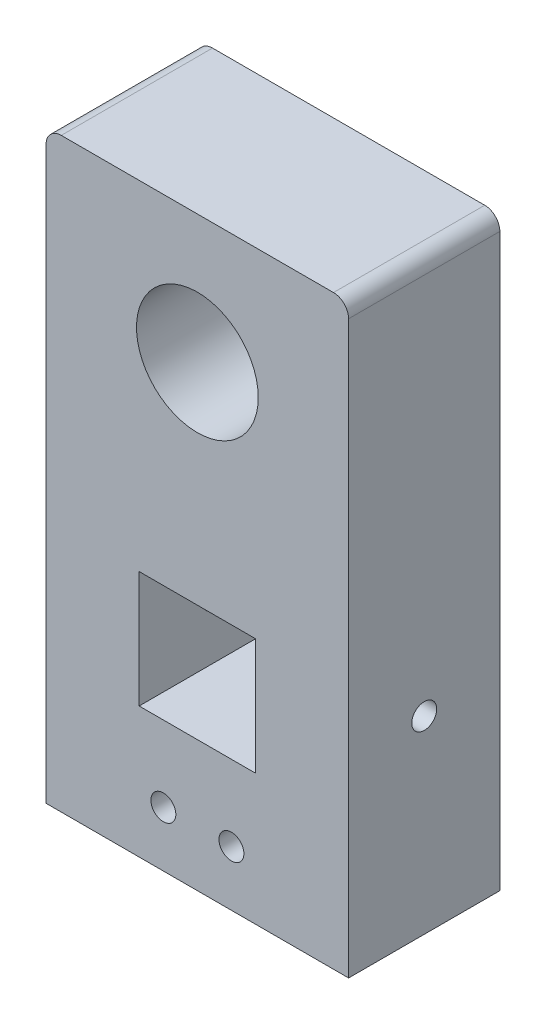
ISO-10303-21;
HEADER;
FILE_DESCRIPTION(('STEP AP214'),'2;1');
FILE_NAME('part.step','',(''),(''),'','','');
FILE_SCHEMA(('AUTOMOTIVE_DESIGN { 1 0 10303 214 1 1 1 1 }'));
ENDSEC;
DATA;
#1=APPLICATION_CONTEXT('core data for automotive mechanical design processes');
#2=APPLICATION_PROTOCOL_DEFINITION('international standard','automotive_design',2000,#1);
#3=PRODUCT_CONTEXT('',#1,'mechanical');
#4=PRODUCT('Part','Part','',(#3));
#5=PRODUCT_RELATED_PRODUCT_CATEGORY('part','',(#4));
#6=PRODUCT_DEFINITION_FORMATION('','',#4);
#7=PRODUCT_DEFINITION_CONTEXT('part definition',#1,'design');
#8=PRODUCT_DEFINITION('design','',#6,#7);
#9=PRODUCT_DEFINITION_SHAPE('','',#8);
#10=(LENGTH_UNIT() NAMED_UNIT(*) SI_UNIT(.MILLI.,.METRE.));
#11=(NAMED_UNIT(*) PLANE_ANGLE_UNIT() SI_UNIT($,.RADIAN.));
#12=(NAMED_UNIT(*) SI_UNIT($,.STERADIAN.) SOLID_ANGLE_UNIT());
#13=UNCERTAINTY_MEASURE_WITH_UNIT(LENGTH_MEASURE(1.E-05),#10,'distance_accuracy_value','');
#14=(GEOMETRIC_REPRESENTATION_CONTEXT(3) GLOBAL_UNCERTAINTY_ASSIGNED_CONTEXT((#13)) GLOBAL_UNIT_ASSIGNED_CONTEXT((#10,
#11,#12)) REPRESENTATION_CONTEXT('',''));
#15=CARTESIAN_POINT('',(0.,0.,0.));
#16=DIRECTION('',(0.,0.,1.));
#17=DIRECTION('',(1.,0.,0.));
#18=AXIS2_PLACEMENT_3D('',#15,#16,#17);
#19=CARTESIAN_POINT('',(0.,0.,20.));
#20=DIRECTION('',(0.,0.,-1.));
#21=DIRECTION('',(-1.,0.,0.));
#22=AXIS2_PLACEMENT_3D('',#19,#20,#21);
#23=PLANE('',#22);
#24=CARTESIAN_POINT('',(0.,10.5,20.));
#25=DIRECTION('',(0.,0.,1.));
#26=DIRECTION('',(1.,0.,0.));
#27=AXIS2_PLACEMENT_3D('',#24,#25,#26);
#28=CIRCLE('',#27,8.05);
#29=CARTESIAN_POINT('',(8.05,10.5,20.));
#30=VERTEX_POINT('',#29);
#31=EDGE_CURVE('E152',#30,#30,#28,.T.);
#32=ORIENTED_EDGE('',*,*,#31,.F.);
#33=EDGE_LOOP('',(#32));
#34=FACE_BOUND('',#33,.T.);
#35=DIRECTION('',(-1.,0.,0.));
#36=VECTOR('',#35,1.);
#37=CARTESIAN_POINT('',(-7.7,-17.3,20.));
#38=LINE('',#37,#36);
#39=CARTESIAN_POINT('',(7.7,-17.3,20.));
#40=VERTEX_POINT('',#39);
#41=CARTESIAN_POINT('',(-7.7,-17.3,20.));
#42=VERTEX_POINT('',#41);
#43=EDGE_CURVE('E384',#40,#42,#38,.T.);
#44=ORIENTED_EDGE('',*,*,#43,.F.);
#45=DIRECTION('',(0.,1.,0.));
#46=VECTOR('',#45,1.);
#47=CARTESIAN_POINT('',(7.7,-32.7,20.));
#48=LINE('',#47,#46);
#49=CARTESIAN_POINT('',(7.7,-32.7,20.));
#50=VERTEX_POINT('',#49);
#51=EDGE_CURVE('E186',#50,#40,#48,.T.);
#52=ORIENTED_EDGE('',*,*,#51,.F.);
#53=DIRECTION('',(1.,0.,0.));
#54=VECTOR('',#53,1.);
#55=CARTESIAN_POINT('',(-7.7,-32.7,20.));
#56=LINE('',#55,#54);
#57=CARTESIAN_POINT('',(-7.7,-32.7,20.));
#58=VERTEX_POINT('',#57);
#59=EDGE_CURVE('E353',#58,#50,#56,.T.);
#60=ORIENTED_EDGE('',*,*,#59,.F.);
#61=DIRECTION('',(0.,-1.,0.));
#62=VECTOR('',#61,1.);
#63=CARTESIAN_POINT('',(-7.7,-32.7,20.));
#64=LINE('',#63,#62);
#65=EDGE_CURVE('E366',#42,#58,#64,.T.);
#66=ORIENTED_EDGE('',*,*,#65,.F.);
#67=EDGE_LOOP('',(#44,#52,#60,#66));
#68=FACE_BOUND('',#67,.T.);
#69=CARTESIAN_POINT('',(-4.49999999999999,-42.7,20.));
#70=DIRECTION('',(0.,0.,1.));
#71=DIRECTION('',(1.,0.,0.));
#72=AXIS2_PLACEMENT_3D('',#69,#70,#71);
#73=CIRCLE('',#72,1.65);
#74=CARTESIAN_POINT('',(-2.84999999999999,-42.7,20.));
#75=VERTEX_POINT('',#74);
#76=EDGE_CURVE('E132',#75,#75,#73,.T.);
#77=ORIENTED_EDGE('',*,*,#76,.F.);
#78=EDGE_LOOP('',(#77));
#79=FACE_BOUND('',#78,.T.);
#80=CARTESIAN_POINT('',(4.50000000000001,-42.7,20.));
#81=DIRECTION('',(0.,0.,1.));
#82=DIRECTION('',(1.,0.,0.));
#83=AXIS2_PLACEMENT_3D('',#80,#81,#82);
#84=CIRCLE('',#83,1.65);
#85=CARTESIAN_POINT('',(6.15000000000001,-42.7,20.));
#86=VERTEX_POINT('',#85);
#87=EDGE_CURVE('E184',#86,#86,#84,.T.);
#88=ORIENTED_EDGE('',*,*,#87,.F.);
#89=EDGE_LOOP('',(#88));
#90=FACE_BOUND('',#89,.T.);
#91=DIRECTION('',(-1.,0.,0.));
#92=VECTOR('',#91,1.);
#93=CARTESIAN_POINT('',(-23.782024239323,-50.,20.));
#94=LINE('',#93,#92);
#95=CARTESIAN_POINT('',(20.,-50.,20.));
#96=VERTEX_POINT('',#95);
#97=CARTESIAN_POINT('',(-20.,-50.,20.));
#98=VERTEX_POINT('',#97);
#99=EDGE_CURVE('E128',#96,#98,#94,.T.);
#100=ORIENTED_EDGE('',*,*,#99,.F.);
#101=DIRECTION('',(0.,1.,0.));
#102=VECTOR('',#101,1.);
#103=CARTESIAN_POINT('',(20.,-27.5,20.));
#104=LINE('',#103,#102);
#105=CARTESIAN_POINT('',(20.,25.5,20.));
#106=VERTEX_POINT('',#105);
#107=EDGE_CURVE('E134',#96,#106,#104,.T.);
#108=ORIENTED_EDGE('',*,*,#107,.T.);
#109=CARTESIAN_POINT('',(18.,25.5,20.));
#110=DIRECTION('',(0.,0.,-1.));
#111=DIRECTION('',(-1.,0.,0.));
#112=AXIS2_PLACEMENT_3D('',#109,#110,#111);
#113=CIRCLE('',#112,2.);
#114=CARTESIAN_POINT('',(18.,27.5,20.));
#115=VERTEX_POINT('',#114);
#116=EDGE_CURVE('E210',#106,#115,#113,.F.);
#117=ORIENTED_EDGE('',*,*,#116,.T.);
#118=DIRECTION('',(-1.,0.,0.));
#119=VECTOR('',#118,1.);
#120=CARTESIAN_POINT('',(-20.,27.5,20.));
#121=LINE('',#120,#119);
#122=CARTESIAN_POINT('',(-18.,27.5,20.));
#123=VERTEX_POINT('',#122);
#124=EDGE_CURVE('E144',#115,#123,#121,.T.);
#125=ORIENTED_EDGE('',*,*,#124,.T.);
#126=CARTESIAN_POINT('',(-18.,25.5,20.));
#127=DIRECTION('',(0.,0.,-1.));
#128=DIRECTION('',(-1.,0.,0.));
#129=AXIS2_PLACEMENT_3D('',#126,#127,#128);
#130=CIRCLE('',#129,2.);
#131=CARTESIAN_POINT('',(-20.,25.5,20.));
#132=VERTEX_POINT('',#131);
#133=EDGE_CURVE('E66',#123,#132,#130,.F.);
#134=ORIENTED_EDGE('',*,*,#133,.T.);
#135=DIRECTION('',(0.,-1.,0.));
#136=VECTOR('',#135,1.);
#137=CARTESIAN_POINT('',(-20.,-27.5,20.));
#138=LINE('',#137,#136);
#139=EDGE_CURVE('E133',#132,#98,#138,.T.);
#140=ORIENTED_EDGE('',*,*,#139,.T.);
#141=EDGE_LOOP('',(#100,#108,#117,#125,#134,#140));
#142=FACE_BOUND('',#141,.T.);
#143=ADVANCED_FACE('F44',(#34,#68,#79,#90,#142),#23,.F.);
#144=CARTESIAN_POINT('',(20.,-27.5,20.));
#145=DIRECTION('',(-1.,0.,0.));
#146=DIRECTION('',(0.,0.,1.));
#147=AXIS2_PLACEMENT_3D('',#144,#145,#146);
#148=PLANE('',#147);
#149=CARTESIAN_POINT('',(20.,-25.,10.));
#150=DIRECTION('',(1.,0.,0.));
#151=DIRECTION('',(0.,0.,-1.));
#152=AXIS2_PLACEMENT_3D('',#149,#150,#151);
#153=CIRCLE('',#152,1.65);
#154=CARTESIAN_POINT('',(20.,-25.,8.35));
#155=VERTEX_POINT('',#154);
#156=EDGE_CURVE('E401',#155,#155,#153,.T.);
#157=ORIENTED_EDGE('',*,*,#156,.F.);
#158=EDGE_LOOP('',(#157));
#159=FACE_BOUND('',#158,.T.);
#160=ORIENTED_EDGE('',*,*,#107,.F.);
#161=DIRECTION('',(0.,0.,-1.));
#162=VECTOR('',#161,1.);
#163=CARTESIAN_POINT('',(20.,-50.,20.));
#164=LINE('',#163,#162);
#165=CARTESIAN_POINT('',(20.,-50.,0.));
#166=VERTEX_POINT('',#165);
#167=EDGE_CURVE('E124',#96,#166,#164,.T.);
#168=ORIENTED_EDGE('',*,*,#167,.T.);
#169=DIRECTION('',(0.,1.,0.));
#170=VECTOR('',#169,1.);
#171=CARTESIAN_POINT('',(20.,-27.5,0.));
#172=LINE('',#171,#170);
#173=CARTESIAN_POINT('',(20.,25.5,0.));
#174=VERTEX_POINT('',#173);
#175=EDGE_CURVE('E157',#166,#174,#172,.T.);
#176=ORIENTED_EDGE('',*,*,#175,.T.);
#177=DIRECTION('',(0.,0.,-1.));
#178=VECTOR('',#177,1.);
#179=CARTESIAN_POINT('',(20.,25.5,20.));
#180=LINE('',#179,#178);
#181=EDGE_CURVE('E142',#174,#106,#180,.F.);
#182=ORIENTED_EDGE('',*,*,#181,.T.);
#183=EDGE_LOOP('',(#160,#168,#176,#182));
#184=FACE_BOUND('',#183,.T.);
#185=ADVANCED_FACE('F138',(#159,#184),#148,.F.);
#186=CARTESIAN_POINT('',(-20.,27.5,20.));
#187=DIRECTION('',(0.,-1.,0.));
#188=DIRECTION('',(0.,0.,-1.));
#189=AXIS2_PLACEMENT_3D('',#186,#187,#188);
#190=PLANE('',#189);
#191=ORIENTED_EDGE('',*,*,#124,.F.);
#192=DIRECTION('',(0.,0.,-1.));
#193=VECTOR('',#192,1.);
#194=CARTESIAN_POINT('',(18.,27.5,20.));
#195=LINE('',#194,#193);
#196=CARTESIAN_POINT('',(18.,27.5,0.));
#197=VERTEX_POINT('',#196);
#198=EDGE_CURVE('E195',#115,#197,#195,.T.);
#199=ORIENTED_EDGE('',*,*,#198,.T.);
#200=DIRECTION('',(-1.,0.,0.));
#201=VECTOR('',#200,1.);
#202=CARTESIAN_POINT('',(-20.,27.5,0.));
#203=LINE('',#202,#201);
#204=CARTESIAN_POINT('',(-18.,27.5,0.));
#205=VERTEX_POINT('',#204);
#206=EDGE_CURVE('E151',#197,#205,#203,.T.);
#207=ORIENTED_EDGE('',*,*,#206,.T.);
#208=DIRECTION('',(0.,0.,-1.));
#209=VECTOR('',#208,1.);
#210=CARTESIAN_POINT('',(-18.,27.5,20.));
#211=LINE('',#210,#209);
#212=EDGE_CURVE('E177',#205,#123,#211,.F.);
#213=ORIENTED_EDGE('',*,*,#212,.T.);
#214=EDGE_LOOP('',(#191,#199,#207,#213));
#215=FACE_BOUND('',#214,.T.);
#216=ADVANCED_FACE('F228',(#215),#190,.F.);
#217=CARTESIAN_POINT('',(-20.,-27.5,20.));
#218=DIRECTION('',(1.,0.,0.));
#219=DIRECTION('',(0.,0.,-1.));
#220=AXIS2_PLACEMENT_3D('',#217,#218,#219);
#221=PLANE('',#220);
#222=CARTESIAN_POINT('',(-20.,-25.,10.));
#223=DIRECTION('',(1.,0.,0.));
#224=DIRECTION('',(0.,0.,-1.));
#225=AXIS2_PLACEMENT_3D('',#222,#223,#224);
#226=CIRCLE('',#225,1.65);
#227=CARTESIAN_POINT('',(-20.,-25.,8.35));
#228=VERTEX_POINT('',#227);
#229=EDGE_CURVE('E137',#228,#228,#226,.T.);
#230=ORIENTED_EDGE('',*,*,#229,.T.);
#231=EDGE_LOOP('',(#230));
#232=FACE_BOUND('',#231,.T.);
#233=DIRECTION('',(0.,-1.,0.));
#234=VECTOR('',#233,1.);
#235=CARTESIAN_POINT('',(-20.,-27.5,0.));
#236=LINE('',#235,#234);
#237=CARTESIAN_POINT('',(-20.,25.5,0.));
#238=VERTEX_POINT('',#237);
#239=CARTESIAN_POINT('',(-20.,-50.,0.));
#240=VERTEX_POINT('',#239);
#241=EDGE_CURVE('E143',#238,#240,#236,.T.);
#242=ORIENTED_EDGE('',*,*,#241,.T.);
#243=DIRECTION('',(0.,0.,1.));
#244=VECTOR('',#243,1.);
#245=CARTESIAN_POINT('',(-20.,-50.,20.));
#246=LINE('',#245,#244);
#247=EDGE_CURVE('E63',#240,#98,#246,.T.);
#248=ORIENTED_EDGE('',*,*,#247,.T.);
#249=ORIENTED_EDGE('',*,*,#139,.F.);
#250=DIRECTION('',(0.,0.,-1.));
#251=VECTOR('',#250,1.);
#252=CARTESIAN_POINT('',(-20.,25.5,20.));
#253=LINE('',#252,#251);
#254=EDGE_CURVE('E54',#132,#238,#253,.T.);
#255=ORIENTED_EDGE('',*,*,#254,.T.);
#256=EDGE_LOOP('',(#242,#248,#249,#255));
#257=FACE_BOUND('',#256,.T.);
#258=ADVANCED_FACE('F212',(#232,#257),#221,.F.);
#259=CARTESIAN_POINT('',(0.,0.,0.));
#260=DIRECTION('',(0.,0.,-1.));
#261=DIRECTION('',(-1.,0.,0.));
#262=AXIS2_PLACEMENT_3D('',#259,#260,#261);
#263=PLANE('',#262);
#264=DIRECTION('',(1.,0.,0.));
#265=VECTOR('',#264,1.);
#266=CARTESIAN_POINT('',(0.,-50.,0.));
#267=LINE('',#266,#265);
#268=EDGE_CURVE('E11',#240,#166,#267,.T.);
#269=ORIENTED_EDGE('',*,*,#268,.F.);
#270=ORIENTED_EDGE('',*,*,#241,.F.);
#271=CARTESIAN_POINT('',(-18.,25.5,0.));
#272=DIRECTION('',(0.,0.,-1.));
#273=DIRECTION('',(-1.,0.,0.));
#274=AXIS2_PLACEMENT_3D('',#271,#272,#273);
#275=CIRCLE('',#274,2.);
#276=EDGE_CURVE('E197',#238,#205,#275,.T.);
#277=ORIENTED_EDGE('',*,*,#276,.T.);
#278=ORIENTED_EDGE('',*,*,#206,.F.);
#279=CARTESIAN_POINT('',(18.,25.5,0.));
#280=DIRECTION('',(0.,0.,-1.));
#281=DIRECTION('',(-1.,0.,0.));
#282=AXIS2_PLACEMENT_3D('',#279,#280,#281);
#283=CIRCLE('',#282,2.);
#284=EDGE_CURVE('E196',#197,#174,#283,.T.);
#285=ORIENTED_EDGE('',*,*,#284,.T.);
#286=ORIENTED_EDGE('',*,*,#175,.F.);
#287=EDGE_LOOP('',(#269,#270,#277,#278,#285,#286));
#288=FACE_BOUND('',#287,.T.);
#289=CARTESIAN_POINT('',(4.50000000000001,-42.7,0.));
#290=DIRECTION('',(0.,0.,-1.));
#291=DIRECTION('',(-1.,0.,0.));
#292=AXIS2_PLACEMENT_3D('',#289,#290,#291);
#293=CIRCLE('',#292,1.65);
#294=CARTESIAN_POINT('',(2.85000000000001,-42.7,0.));
#295=VERTEX_POINT('',#294);
#296=EDGE_CURVE('E183',#295,#295,#293,.T.);
#297=ORIENTED_EDGE('',*,*,#296,.F.);
#298=EDGE_LOOP('',(#297));
#299=FACE_BOUND('',#298,.T.);
#300=CARTESIAN_POINT('',(-4.49999999999999,-42.7,0.));
#301=DIRECTION('',(0.,0.,-1.));
#302=DIRECTION('',(-1.,0.,0.));
#303=AXIS2_PLACEMENT_3D('',#300,#301,#302);
#304=CIRCLE('',#303,1.65);
#305=CARTESIAN_POINT('',(-6.14999999999999,-42.7,0.));
#306=VERTEX_POINT('',#305);
#307=EDGE_CURVE('E179',#306,#306,#304,.T.);
#308=ORIENTED_EDGE('',*,*,#307,.F.);
#309=EDGE_LOOP('',(#308));
#310=FACE_BOUND('',#309,.T.);
#311=DIRECTION('',(0.,-1.,0.));
#312=VECTOR('',#311,1.);
#313=CARTESIAN_POINT('',(7.7,0.,0.));
#314=LINE('',#313,#312);
#315=CARTESIAN_POINT('',(7.7,-17.3,0.));
#316=VERTEX_POINT('',#315);
#317=CARTESIAN_POINT('',(7.7,-32.7,0.));
#318=VERTEX_POINT('',#317);
#319=EDGE_CURVE('E176',#316,#318,#314,.T.);
#320=ORIENTED_EDGE('',*,*,#319,.F.);
#321=DIRECTION('',(1.,0.,0.));
#322=VECTOR('',#321,1.);
#323=CARTESIAN_POINT('',(0.,-17.3,0.));
#324=LINE('',#323,#322);
#325=CARTESIAN_POINT('',(-7.7,-17.3,0.));
#326=VERTEX_POINT('',#325);
#327=EDGE_CURVE('E158',#326,#316,#324,.T.);
#328=ORIENTED_EDGE('',*,*,#327,.F.);
#329=DIRECTION('',(0.,1.,0.));
#330=VECTOR('',#329,1.);
#331=CARTESIAN_POINT('',(-7.7,0.,0.));
#332=LINE('',#331,#330);
#333=CARTESIAN_POINT('',(-7.7,-32.7,0.));
#334=VERTEX_POINT('',#333);
#335=EDGE_CURVE('E169',#334,#326,#332,.T.);
#336=ORIENTED_EDGE('',*,*,#335,.F.);
#337=DIRECTION('',(-1.,0.,0.));
#338=VECTOR('',#337,1.);
#339=CARTESIAN_POINT('',(0.,-32.7,0.));
#340=LINE('',#339,#338);
#341=EDGE_CURVE('E173',#318,#334,#340,.T.);
#342=ORIENTED_EDGE('',*,*,#341,.F.);
#343=EDGE_LOOP('',(#320,#328,#336,#342));
#344=FACE_BOUND('',#343,.T.);
#345=CARTESIAN_POINT('',(0.,10.5,0.));
#346=DIRECTION('',(0.,0.,1.));
#347=DIRECTION('',(1.,0.,0.));
#348=AXIS2_PLACEMENT_3D('',#345,#346,#347);
#349=CIRCLE('',#348,8.05);
#350=CARTESIAN_POINT('',(8.05,10.5,0.));
#351=VERTEX_POINT('',#350);
#352=EDGE_CURVE('E161',#351,#351,#349,.T.);
#353=ORIENTED_EDGE('',*,*,#352,.T.);
#354=EDGE_LOOP('',(#353));
#355=FACE_BOUND('',#354,.T.);
#356=ADVANCED_FACE('F218',(#288,#299,#310,#344,#355),#263,.T.);
#357=CARTESIAN_POINT('',(0.,10.5,0.));
#358=DIRECTION('',(0.,0.,1.));
#359=DIRECTION('',(1.,0.,0.));
#360=AXIS2_PLACEMENT_3D('',#357,#358,#359);
#361=CYLINDRICAL_SURFACE('',#360,8.05);
#362=ORIENTED_EDGE('',*,*,#352,.F.);
#363=EDGE_LOOP('',(#362));
#364=FACE_BOUND('',#363,.T.);
#365=ORIENTED_EDGE('',*,*,#31,.T.);
#366=EDGE_LOOP('',(#365));
#367=FACE_BOUND('',#366,.T.);
#368=ADVANCED_FACE('F248',(#364,#367),#361,.F.);
#369=CARTESIAN_POINT('',(7.7,-32.7,-980.));
#370=DIRECTION('',(1.,0.,0.));
#371=DIRECTION('',(0.,0.,-1.));
#372=AXIS2_PLACEMENT_3D('',#369,#370,#371);
#373=PLANE('',#372);
#374=CARTESIAN_POINT('',(7.70000000000004,-25.,10.));
#375=DIRECTION('',(1.,0.,0.));
#376=DIRECTION('',(0.,0.,-1.));
#377=AXIS2_PLACEMENT_3D('',#374,#375,#376);
#378=CIRCLE('',#377,1.65);
#379=CARTESIAN_POINT('',(7.70000000000004,-25.,8.35));
#380=VERTEX_POINT('',#379);
#381=EDGE_CURVE('E343',#380,#380,#378,.T.);
#382=ORIENTED_EDGE('',*,*,#381,.T.);
#383=EDGE_LOOP('',(#382));
#384=FACE_BOUND('',#383,.T.);
#385=ORIENTED_EDGE('',*,*,#319,.T.);
#386=DIRECTION('',(0.,0.,1.));
#387=VECTOR('',#386,1.);
#388=CARTESIAN_POINT('',(7.7,-32.7,-980.));
#389=LINE('',#388,#387);
#390=EDGE_CURVE('E342',#318,#50,#389,.T.);
#391=ORIENTED_EDGE('',*,*,#390,.T.);
#392=ORIENTED_EDGE('',*,*,#51,.T.);
#393=DIRECTION('',(0.,0.,1.));
#394=VECTOR('',#393,1.);
#395=CARTESIAN_POINT('',(7.7,-17.3,-980.));
#396=LINE('',#395,#394);
#397=EDGE_CURVE('E348',#316,#40,#396,.T.);
#398=ORIENTED_EDGE('',*,*,#397,.F.);
#399=EDGE_LOOP('',(#385,#391,#392,#398));
#400=FACE_BOUND('',#399,.T.);
#401=ADVANCED_FACE('F327',(#384,#400),#373,.F.);
#402=CARTESIAN_POINT('',(-7.7,-32.7,-980.));
#403=DIRECTION('',(0.,-1.,0.));
#404=DIRECTION('',(0.,0.,-1.));
#405=AXIS2_PLACEMENT_3D('',#402,#403,#404);
#406=PLANE('',#405);
#407=ORIENTED_EDGE('',*,*,#341,.T.);
#408=DIRECTION('',(0.,0.,1.));
#409=VECTOR('',#408,1.);
#410=CARTESIAN_POINT('',(-7.7,-32.7,-980.));
#411=LINE('',#410,#409);
#412=EDGE_CURVE('E357',#334,#58,#411,.T.);
#413=ORIENTED_EDGE('',*,*,#412,.T.);
#414=ORIENTED_EDGE('',*,*,#59,.T.);
#415=ORIENTED_EDGE('',*,*,#390,.F.);
#416=EDGE_LOOP('',(#407,#413,#414,#415));
#417=FACE_BOUND('',#416,.T.);
#418=ADVANCED_FACE('F325',(#417),#406,.F.);
#419=CARTESIAN_POINT('',(-7.7,-32.7,-980.));
#420=DIRECTION('',(-1.,0.,0.));
#421=DIRECTION('',(0.,0.,1.));
#422=AXIS2_PLACEMENT_3D('',#419,#420,#421);
#423=PLANE('',#422);
#424=CARTESIAN_POINT('',(-7.70000000000004,-25.,10.));
#425=DIRECTION('',(-1.,0.,0.));
#426=DIRECTION('',(0.,0.,1.));
#427=AXIS2_PLACEMENT_3D('',#424,#425,#426);
#428=CIRCLE('',#427,1.65);
#429=CARTESIAN_POINT('',(-7.70000000000004,-25.,11.65));
#430=VERTEX_POINT('',#429);
#431=EDGE_CURVE('E47',#430,#430,#428,.T.);
#432=ORIENTED_EDGE('',*,*,#431,.T.);
#433=EDGE_LOOP('',(#432));
#434=FACE_BOUND('',#433,.T.);
#435=ORIENTED_EDGE('',*,*,#335,.T.);
#436=DIRECTION('',(0.,0.,1.));
#437=VECTOR('',#436,1.);
#438=CARTESIAN_POINT('',(-7.7,-17.3,-980.));
#439=LINE('',#438,#437);
#440=EDGE_CURVE('E361',#326,#42,#439,.T.);
#441=ORIENTED_EDGE('',*,*,#440,.T.);
#442=ORIENTED_EDGE('',*,*,#65,.T.);
#443=ORIENTED_EDGE('',*,*,#412,.F.);
#444=EDGE_LOOP('',(#435,#441,#442,#443));
#445=FACE_BOUND('',#444,.T.);
#446=ADVANCED_FACE('F322',(#434,#445),#423,.F.);
#447=CARTESIAN_POINT('',(-7.7,-17.3,-980.));
#448=DIRECTION('',(0.,1.,0.));
#449=DIRECTION('',(0.,0.,1.));
#450=AXIS2_PLACEMENT_3D('',#447,#448,#449);
#451=PLANE('',#450);
#452=ORIENTED_EDGE('',*,*,#327,.T.);
#453=ORIENTED_EDGE('',*,*,#397,.T.);
#454=ORIENTED_EDGE('',*,*,#43,.T.);
#455=ORIENTED_EDGE('',*,*,#440,.F.);
#456=EDGE_LOOP('',(#452,#453,#454,#455));
#457=FACE_BOUND('',#456,.T.);
#458=ADVANCED_FACE('F318',(#457),#451,.F.);
#459=CARTESIAN_POINT('',(-4.49999999999999,-42.7,-20.));
#460=DIRECTION('',(0.,0.,1.));
#461=DIRECTION('',(1.,0.,0.));
#462=AXIS2_PLACEMENT_3D('',#459,#460,#461);
#463=CYLINDRICAL_SURFACE('',#462,1.65);
#464=ORIENTED_EDGE('',*,*,#307,.T.);
#465=EDGE_LOOP('',(#464));
#466=FACE_BOUND('',#465,.T.);
#467=ORIENTED_EDGE('',*,*,#76,.T.);
#468=EDGE_LOOP('',(#467));
#469=FACE_BOUND('',#468,.T.);
#470=ADVANCED_FACE('F320',(#466,#469),#463,.F.);
#471=CARTESIAN_POINT('',(4.50000000000001,-42.7,-20.));
#472=DIRECTION('',(0.,0.,1.));
#473=DIRECTION('',(1.,0.,0.));
#474=AXIS2_PLACEMENT_3D('',#471,#472,#473);
#475=CYLINDRICAL_SURFACE('',#474,1.65);
#476=ORIENTED_EDGE('',*,*,#296,.T.);
#477=EDGE_LOOP('',(#476));
#478=FACE_BOUND('',#477,.T.);
#479=ORIENTED_EDGE('',*,*,#87,.T.);
#480=EDGE_LOOP('',(#479));
#481=FACE_BOUND('',#480,.T.);
#482=ADVANCED_FACE('F236',(#478,#481),#475,.F.);
#483=CARTESIAN_POINT('',(18.,25.5,20.));
#484=DIRECTION('',(0.,0.,-1.));
#485=DIRECTION('',(-1.,0.,0.));
#486=AXIS2_PLACEMENT_3D('',#483,#484,#485);
#487=CYLINDRICAL_SURFACE('',#486,2.);
#488=ORIENTED_EDGE('',*,*,#116,.F.);
#489=ORIENTED_EDGE('',*,*,#181,.F.);
#490=ORIENTED_EDGE('',*,*,#284,.F.);
#491=ORIENTED_EDGE('',*,*,#198,.F.);
#492=EDGE_LOOP('',(#488,#489,#490,#491));
#493=FACE_BOUND('',#492,.T.);
#494=ADVANCED_FACE('F225',(#493),#487,.T.);
#495=CARTESIAN_POINT('',(-18.,25.5,20.));
#496=DIRECTION('',(0.,0.,-1.));
#497=DIRECTION('',(-1.,0.,0.));
#498=AXIS2_PLACEMENT_3D('',#495,#496,#497);
#499=CYLINDRICAL_SURFACE('',#498,2.);
#500=ORIENTED_EDGE('',*,*,#133,.F.);
#501=ORIENTED_EDGE('',*,*,#212,.F.);
#502=ORIENTED_EDGE('',*,*,#276,.F.);
#503=ORIENTED_EDGE('',*,*,#254,.F.);
#504=EDGE_LOOP('',(#500,#501,#502,#503));
#505=FACE_BOUND('',#504,.T.);
#506=ADVANCED_FACE('F50',(#505),#499,.T.);
#507=CARTESIAN_POINT('',(-23.782024239323,-50.,-80.));
#508=DIRECTION('',(0.,1.,0.));
#509=DIRECTION('',(0.,0.,1.));
#510=AXIS2_PLACEMENT_3D('',#507,#508,#509);
#511=PLANE('',#510);
#512=ORIENTED_EDGE('',*,*,#99,.T.);
#513=ORIENTED_EDGE('',*,*,#247,.F.);
#514=ORIENTED_EDGE('',*,*,#268,.T.);
#515=ORIENTED_EDGE('',*,*,#167,.F.);
#516=EDGE_LOOP('',(#512,#513,#514,#515));
#517=FACE_BOUND('',#516,.T.);
#518=ADVANCED_FACE('F123',(#517),#511,.F.);
#519=CARTESIAN_POINT('',(-980.,-25.,10.));
#520=DIRECTION('',(1.,0.,0.));
#521=DIRECTION('',(0.,0.,-1.));
#522=AXIS2_PLACEMENT_3D('',#519,#520,#521);
#523=CYLINDRICAL_SURFACE('',#522,1.65);
#524=ORIENTED_EDGE('',*,*,#431,.F.);
#525=EDGE_LOOP('',(#524));
#526=FACE_BOUND('',#525,.T.);
#527=ORIENTED_EDGE('',*,*,#229,.F.);
#528=EDGE_LOOP('',(#527));
#529=FACE_BOUND('',#528,.T.);
#530=ADVANCED_FACE('F234',(#526,#529),#523,.F.);
#531=ORIENTED_EDGE('',*,*,#156,.T.);
#532=EDGE_LOOP('',(#531));
#533=FACE_BOUND('',#532,.T.);
#534=ORIENTED_EDGE('',*,*,#381,.F.);
#535=EDGE_LOOP('',(#534));
#536=FACE_BOUND('',#535,.T.);
#537=ADVANCED_FACE('F297',(#533,#536),#523,.F.);
#538=CLOSED_SHELL('',(#143,#185,#216,#258,#356,#368,#401,#418,#446,#458,#470,#482,#494,#506,
#518,#530,#537));
#539=MANIFOLD_SOLID_BREP('B2',#538);
#540=ADVANCED_BREP_SHAPE_REPRESENTATION('',(#18,#539),#14);
#541=SHAPE_DEFINITION_REPRESENTATION(#9,#540);
ENDSEC;
END-ISO-10303-21;
